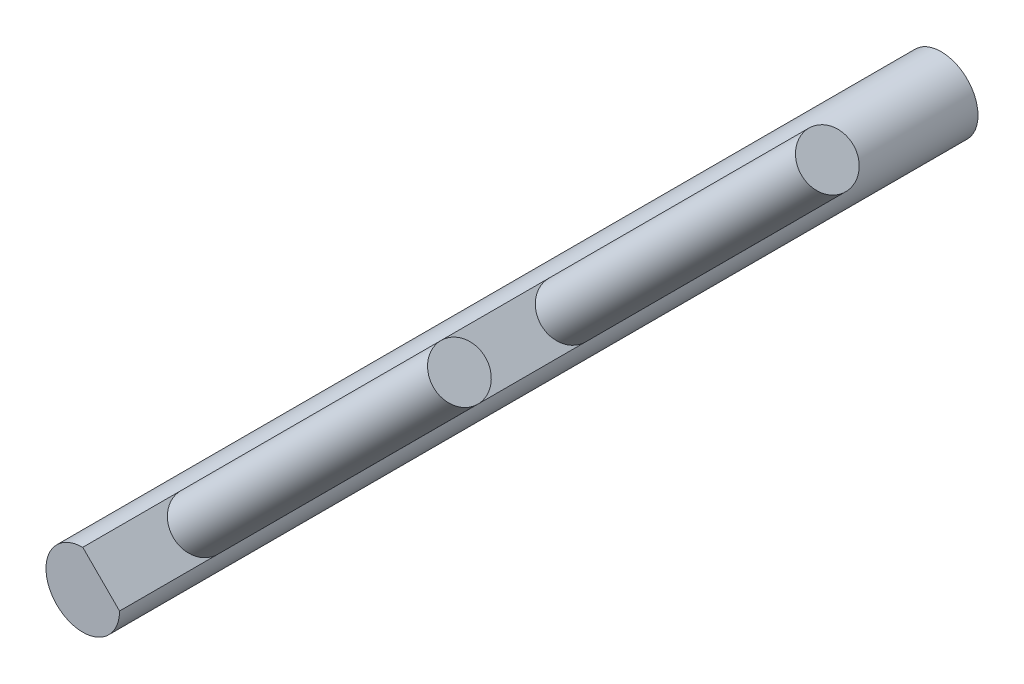
ISO-10303-21;
HEADER;
FILE_DESCRIPTION(('STEP AP214'),'2;1');
FILE_NAME('part.step','',(''),(''),'','','');
FILE_SCHEMA(('AUTOMOTIVE_DESIGN { 1 0 10303 214 1 1 1 1 }'));
ENDSEC;
DATA;
#1=APPLICATION_CONTEXT('core data for automotive mechanical design processes');
#2=APPLICATION_PROTOCOL_DEFINITION('international standard','automotive_design',2000,#1);
#3=PRODUCT_CONTEXT('',#1,'mechanical');
#4=PRODUCT('Part','Part','',(#3));
#5=PRODUCT_RELATED_PRODUCT_CATEGORY('part','',(#4));
#6=PRODUCT_DEFINITION_FORMATION('','',#4);
#7=PRODUCT_DEFINITION_CONTEXT('part definition',#1,'design');
#8=PRODUCT_DEFINITION('design','',#6,#7);
#9=PRODUCT_DEFINITION_SHAPE('','',#8);
#10=(LENGTH_UNIT() NAMED_UNIT(*) SI_UNIT(.MILLI.,.METRE.));
#11=(NAMED_UNIT(*) PLANE_ANGLE_UNIT() SI_UNIT($,.RADIAN.));
#12=(NAMED_UNIT(*) SI_UNIT($,.STERADIAN.) SOLID_ANGLE_UNIT());
#13=UNCERTAINTY_MEASURE_WITH_UNIT(LENGTH_MEASURE(1.E-05),#10,'distance_accuracy_value','');
#14=(GEOMETRIC_REPRESENTATION_CONTEXT(3) GLOBAL_UNCERTAINTY_ASSIGNED_CONTEXT((#13)) GLOBAL_UNIT_ASSIGNED_CONTEXT((#10,
#11,#12)) REPRESENTATION_CONTEXT('',''));
#15=CARTESIAN_POINT('',(0.,0.,0.));
#16=DIRECTION('',(0.,0.,1.));
#17=DIRECTION('',(1.,0.,0.));
#18=AXIS2_PLACEMENT_3D('',#15,#16,#17);
#19=CARTESIAN_POINT('',(0.,3.,70.));
#20=DIRECTION('',(-0.707106781186548,-0.707106781186548,0.));
#21=DIRECTION('',(0.707106781186548,-0.707106781186548,0.));
#22=AXIS2_PLACEMENT_3D('',#19,#20,#21);
#23=PLANE('',#22);
#24=CARTESIAN_POINT('',(1.5,1.5,62.));
#25=DIRECTION('',(0.707106781186548,0.707106781186547,0.));
#26=DIRECTION('',(-0.707106781186547,0.707106781186548,0.));
#27=AXIS2_PLACEMENT_3D('',#24,#25,#26);
#28=CIRCLE('',#27,2.12132034355965);
#29=CARTESIAN_POINT('',(3.,0.,62.));
#30=VERTEX_POINT('',#29);
#31=CARTESIAN_POINT('',(0.,3.,62.));
#32=VERTEX_POINT('',#31);
#33=EDGE_CURVE('E94',#30,#32,#28,.T.);
#34=ORIENTED_EDGE('',*,*,#33,.F.);
#35=DIRECTION('',(0.,0.,-1.));
#36=VECTOR('',#35,1.);
#37=CARTESIAN_POINT('',(3.,0.,70.));
#38=LINE('',#37,#36);
#39=CARTESIAN_POINT('',(3.,0.,32.));
#40=VERTEX_POINT('',#39);
#41=EDGE_CURVE('E84',#30,#40,#38,.T.);
#42=ORIENTED_EDGE('',*,*,#41,.T.);
#43=CARTESIAN_POINT('',(1.5,1.5,32.));
#44=DIRECTION('',(0.707106781186548,0.707106781186547,0.));
#45=DIRECTION('',(-0.707106781186547,0.707106781186548,0.));
#46=AXIS2_PLACEMENT_3D('',#43,#44,#45);
#47=CIRCLE('',#46,2.12132034355964);
#48=CARTESIAN_POINT('',(0.,3.,32.));
#49=VERTEX_POINT('',#48);
#50=EDGE_CURVE('E99',#49,#40,#47,.T.);
#51=ORIENTED_EDGE('',*,*,#50,.F.);
#52=DIRECTION('',(0.,0.,-1.));
#53=VECTOR('',#52,1.);
#54=CARTESIAN_POINT('',(0.,3.,70.));
#55=LINE('',#54,#53);
#56=EDGE_CURVE('E39',#32,#49,#55,.T.);
#57=ORIENTED_EDGE('',*,*,#56,.F.);
#58=EDGE_LOOP('',(#34,#42,#51,#57));
#59=FACE_BOUND('',#58,.T.);
#60=ADVANCED_FACE('F35',(#59),#23,.F.);
#61=EDGE_CURVE('E53',#32,#30,#28,.T.);
#62=ORIENTED_EDGE('',*,*,#61,.F.);
#63=CARTESIAN_POINT('',(0.,3.,70.));
#64=VERTEX_POINT('',#63);
#65=EDGE_CURVE('E123',#64,#32,#55,.T.);
#66=ORIENTED_EDGE('',*,*,#65,.F.);
#67=DIRECTION('',(-0.707106781186548,0.707106781186548,0.));
#68=VECTOR('',#67,1.);
#69=CARTESIAN_POINT('',(0.,3.,70.));
#70=LINE('',#69,#68);
#71=CARTESIAN_POINT('',(3.,0.,70.));
#72=VERTEX_POINT('',#71);
#73=EDGE_CURVE('E80',#72,#64,#70,.T.);
#74=ORIENTED_EDGE('',*,*,#73,.F.);
#75=EDGE_CURVE('E77',#72,#30,#38,.T.);
#76=ORIENTED_EDGE('',*,*,#75,.T.);
#77=EDGE_LOOP('',(#62,#66,#74,#76));
#78=FACE_BOUND('',#77,.T.);
#79=ADVANCED_FACE('F79',(#78),#23,.F.);
#80=CARTESIAN_POINT('',(1.5,1.5,32.));
#81=DIRECTION('',(-0.707106781186548,-0.707106781186548,0.));
#82=DIRECTION('',(0.707106781186548,-0.707106781186548,0.));
#83=AXIS2_PLACEMENT_3D('',#80,#81,#82);
#84=CIRCLE('',#83,2.12132034355964);
#85=EDGE_CURVE('E11',#40,#49,#84,.F.);
#86=ORIENTED_EDGE('',*,*,#85,.F.);
#87=CARTESIAN_POINT('',(3.,0.,15.));
#88=VERTEX_POINT('',#87);
#89=EDGE_CURVE('E90',#40,#88,#38,.T.);
#90=ORIENTED_EDGE('',*,*,#89,.T.);
#91=DIRECTION('',(-0.707106781186548,0.707106781186548,0.));
#92=VECTOR('',#91,1.);
#93=CARTESIAN_POINT('',(0.,3.,15.));
#94=LINE('',#93,#92);
#95=CARTESIAN_POINT('',(0.,3.,15.));
#96=VERTEX_POINT('',#95);
#97=EDGE_CURVE('E107',#88,#96,#94,.T.);
#98=ORIENTED_EDGE('',*,*,#97,.T.);
#99=EDGE_CURVE('E112',#49,#96,#55,.T.);
#100=ORIENTED_EDGE('',*,*,#99,.F.);
#101=EDGE_LOOP('',(#86,#90,#98,#100));
#102=FACE_BOUND('',#101,.T.);
#103=ADVANCED_FACE('F133',(#102),#23,.F.);
#104=CARTESIAN_POINT('',(0.,0.,15.));
#105=DIRECTION('',(0.,0.,-1.));
#106=DIRECTION('',(-1.,0.,0.));
#107=AXIS2_PLACEMENT_3D('',#104,#105,#106);
#108=CYLINDRICAL_SURFACE('',#107,3.);
#109=CARTESIAN_POINT('',(0.,0.,15.));
#110=DIRECTION('',(0.,0.,1.));
#111=DIRECTION('',(1.,0.,0.));
#112=AXIS2_PLACEMENT_3D('',#109,#110,#111);
#113=CIRCLE('',#112,3.);
#114=EDGE_CURVE('E45',#88,#96,#113,.T.);
#115=ORIENTED_EDGE('',*,*,#114,.F.);
#116=ORIENTED_EDGE('',*,*,#89,.F.);
#117=ORIENTED_EDGE('',*,*,#41,.F.);
#118=ORIENTED_EDGE('',*,*,#75,.F.);
#119=CARTESIAN_POINT('',(0.,0.,70.));
#120=DIRECTION('',(0.,0.,1.));
#121=DIRECTION('',(1.,0.,0.));
#122=AXIS2_PLACEMENT_3D('',#119,#120,#121);
#123=CIRCLE('',#122,3.);
#124=EDGE_CURVE('E109',#64,#72,#123,.T.);
#125=ORIENTED_EDGE('',*,*,#124,.F.);
#126=ORIENTED_EDGE('',*,*,#65,.T.);
#127=ORIENTED_EDGE('',*,*,#56,.T.);
#128=ORIENTED_EDGE('',*,*,#99,.T.);
#129=EDGE_LOOP('',(#115,#116,#117,#118,#125,#126,#127,#128));
#130=FACE_BOUND('',#129,.T.);
#131=CARTESIAN_POINT('',(0.,0.,0.));
#132=DIRECTION('',(0.,0.,1.));
#133=DIRECTION('',(1.,0.,0.));
#134=AXIS2_PLACEMENT_3D('',#131,#132,#133);
#135=CIRCLE('',#134,3.);
#136=CARTESIAN_POINT('',(3.,0.,0.));
#137=VERTEX_POINT('',#136);
#138=EDGE_CURVE('E138',#137,#137,#135,.T.);
#139=ORIENTED_EDGE('',*,*,#138,.T.);
#140=EDGE_LOOP('',(#139));
#141=FACE_BOUND('',#140,.T.);
#142=ADVANCED_FACE('F37',(#130,#141),#108,.T.);
#143=CARTESIAN_POINT('',(0.,0.,15.));
#144=DIRECTION('',(0.,0.,1.));
#145=DIRECTION('',(1.,0.,0.));
#146=AXIS2_PLACEMENT_3D('',#143,#144,#145);
#147=PLANE('',#146);
#148=ORIENTED_EDGE('',*,*,#97,.F.);
#149=ORIENTED_EDGE('',*,*,#114,.T.);
#150=EDGE_LOOP('',(#148,#149));
#151=FACE_BOUND('',#150,.T.);
#152=ADVANCED_FACE('F137',(#151),#147,.T.);
#153=CARTESIAN_POINT('',(0.,0.,0.));
#154=DIRECTION('',(0.,0.,1.));
#155=DIRECTION('',(1.,0.,0.));
#156=AXIS2_PLACEMENT_3D('',#153,#154,#155);
#157=PLANE('',#156);
#158=CARTESIAN_POINT('',(0.,0.,0.));
#159=DIRECTION('',(0.,0.,-1.));
#160=DIRECTION('',(-1.,0.,0.));
#161=AXIS2_PLACEMENT_3D('',#158,#159,#160);
#162=CIRCLE('',#161,2.5);
#163=CARTESIAN_POINT('',(-2.5,0.,0.));
#164=VERTEX_POINT('',#163);
#165=EDGE_CURVE('E83',#164,#164,#162,.T.);
#166=ORIENTED_EDGE('',*,*,#165,.F.);
#167=EDGE_LOOP('',(#166));
#168=FACE_BOUND('',#167,.T.);
#169=ORIENTED_EDGE('',*,*,#138,.F.);
#170=EDGE_LOOP('',(#169));
#171=FACE_BOUND('',#170,.T.);
#172=ADVANCED_FACE('F151',(#168,#171),#157,.F.);
#173=CARTESIAN_POINT('',(0.,0.,5.));
#174=DIRECTION('',(0.,0.,-1.));
#175=DIRECTION('',(-1.,0.,0.));
#176=AXIS2_PLACEMENT_3D('',#173,#174,#175);
#177=CYLINDRICAL_SURFACE('',#176,2.5);
#178=CARTESIAN_POINT('',(0.,0.,5.));
#179=DIRECTION('',(0.,0.,-1.));
#180=DIRECTION('',(-1.,0.,0.));
#181=AXIS2_PLACEMENT_3D('',#178,#179,#180);
#182=CIRCLE('',#181,2.5);
#183=CARTESIAN_POINT('',(-2.5,0.,5.));
#184=VERTEX_POINT('',#183);
#185=EDGE_CURVE('E115',#184,#184,#182,.T.);
#186=ORIENTED_EDGE('',*,*,#185,.F.);
#187=EDGE_LOOP('',(#186));
#188=FACE_BOUND('',#187,.T.);
#189=ORIENTED_EDGE('',*,*,#165,.T.);
#190=EDGE_LOOP('',(#189));
#191=FACE_BOUND('',#190,.T.);
#192=ADVANCED_FACE('F149',(#188,#191),#177,.F.);
#193=CARTESIAN_POINT('',(0.,0.,5.));
#194=DIRECTION('',(0.,0.,-1.));
#195=DIRECTION('',(-1.,0.,0.));
#196=AXIS2_PLACEMENT_3D('',#193,#194,#195);
#197=PLANE('',#196);
#198=ORIENTED_EDGE('',*,*,#185,.T.);
#199=EDGE_LOOP('',(#198));
#200=FACE_BOUND('',#199,.T.);
#201=ADVANCED_FACE('F147',(#200),#197,.T.);
#202=CARTESIAN_POINT('',(0.,0.,70.));
#203=DIRECTION('',(0.,0.,1.));
#204=DIRECTION('',(1.,0.,0.));
#205=AXIS2_PLACEMENT_3D('',#202,#203,#204);
#206=PLANE('',#205);
#207=ORIENTED_EDGE('',*,*,#124,.T.);
#208=ORIENTED_EDGE('',*,*,#73,.T.);
#209=EDGE_LOOP('',(#207,#208));
#210=FACE_BOUND('',#209,.T.);
#211=ADVANCED_FACE('F157',(#210),#206,.T.);
#212=CARTESIAN_POINT('',(22.7132034355964,22.7132034355964,32.));
#213=DIRECTION('',(-0.707106781186548,-0.707106781186547,0.));
#214=DIRECTION('',(0.707106781186547,-0.707106781186548,0.));
#215=AXIS2_PLACEMENT_3D('',#212,#213,#214);
#216=CYLINDRICAL_SURFACE('',#215,2.12132034355964);
#217=CARTESIAN_POINT('',(22.7132034355964,22.7132034355964,32.));
#218=DIRECTION('',(0.707106781186548,0.707106781186547,0.));
#219=DIRECTION('',(-0.707106781186547,0.707106781186548,0.));
#220=AXIS2_PLACEMENT_3D('',#217,#218,#219);
#221=CIRCLE('',#220,2.12132034355964);
#222=CARTESIAN_POINT('',(21.2132034355964,24.2132034355964,32.));
#223=VERTEX_POINT('',#222);
#224=EDGE_CURVE('E101',#223,#223,#221,.T.);
#225=ORIENTED_EDGE('',*,*,#224,.F.);
#226=EDGE_LOOP('',(#225));
#227=FACE_BOUND('',#226,.T.);
#228=ORIENTED_EDGE('',*,*,#50,.T.);
#229=ORIENTED_EDGE('',*,*,#85,.T.);
#230=EDGE_LOOP('',(#228,#229));
#231=FACE_BOUND('',#230,.T.);
#232=ADVANCED_FACE('F199',(#227,#231),#216,.T.);
#233=CARTESIAN_POINT('',(22.7132034355964,22.7132034355964,32.));
#234=DIRECTION('',(0.707106781186548,0.707106781186547,0.));
#235=DIRECTION('',(-0.707106781186547,0.707106781186548,0.));
#236=AXIS2_PLACEMENT_3D('',#233,#234,#235);
#237=PLANE('',#236);
#238=ORIENTED_EDGE('',*,*,#224,.T.);
#239=EDGE_LOOP('',(#238));
#240=FACE_BOUND('',#239,.T.);
#241=ADVANCED_FACE('F206',(#240),#237,.T.);
#242=CARTESIAN_POINT('',(22.7132034355964,22.7132034355964,62.));
#243=DIRECTION('',(-0.707106781186548,-0.707106781186547,0.));
#244=DIRECTION('',(0.707106781186547,-0.707106781186548,0.));
#245=AXIS2_PLACEMENT_3D('',#242,#243,#244);
#246=CYLINDRICAL_SURFACE('',#245,2.12132034355965);
#247=CARTESIAN_POINT('',(22.7132034355964,22.7132034355964,62.));
#248=DIRECTION('',(0.707106781186548,0.707106781186547,0.));
#249=DIRECTION('',(-0.707106781186547,0.707106781186548,0.));
#250=AXIS2_PLACEMENT_3D('',#247,#248,#249);
#251=CIRCLE('',#250,2.12132034355965);
#252=CARTESIAN_POINT('',(21.2132034355964,24.2132034355964,62.));
#253=VERTEX_POINT('',#252);
#254=EDGE_CURVE('E96',#253,#253,#251,.T.);
#255=ORIENTED_EDGE('',*,*,#254,.F.);
#256=EDGE_LOOP('',(#255));
#257=FACE_BOUND('',#256,.T.);
#258=ORIENTED_EDGE('',*,*,#61,.T.);
#259=ORIENTED_EDGE('',*,*,#33,.T.);
#260=EDGE_LOOP('',(#258,#259));
#261=FACE_BOUND('',#260,.T.);
#262=ADVANCED_FACE('F98',(#257,#261),#246,.T.);
#263=CARTESIAN_POINT('',(22.7132034355964,22.7132034355964,62.));
#264=DIRECTION('',(0.707106781186548,0.707106781186547,0.));
#265=DIRECTION('',(-0.707106781186547,0.707106781186548,0.));
#266=AXIS2_PLACEMENT_3D('',#263,#264,#265);
#267=PLANE('',#266);
#268=ORIENTED_EDGE('',*,*,#254,.T.);
#269=EDGE_LOOP('',(#268));
#270=FACE_BOUND('',#269,.T.);
#271=ADVANCED_FACE('F221',(#270),#267,.T.);
#272=CLOSED_SHELL('',(#60,#79,#103,#142,#152,#172,#192,#201,#211,#232,#241,#262,#271));
#273=MANIFOLD_SOLID_BREP('B2',#272);
#274=ADVANCED_BREP_SHAPE_REPRESENTATION('',(#18,#273),#14);
#275=SHAPE_DEFINITION_REPRESENTATION(#9,#274);
ENDSEC;
END-ISO-10303-21;
